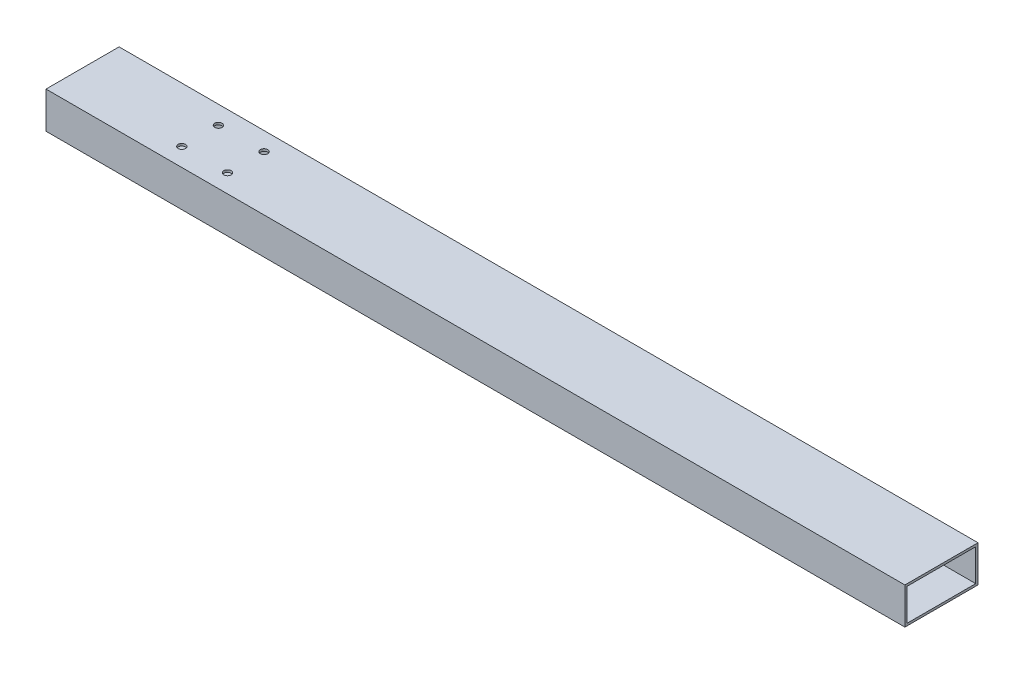
ISO-10303-21;
HEADER;
FILE_DESCRIPTION(('STEP AP214'),'2;1');
FILE_NAME('part.step','',(''),(''),'','','');
FILE_SCHEMA(('AUTOMOTIVE_DESIGN { 1 0 10303 214 1 1 1 1 }'));
ENDSEC;
DATA;
#1=APPLICATION_CONTEXT('core data for automotive mechanical design processes');
#2=APPLICATION_PROTOCOL_DEFINITION('international standard','automotive_design',2000,#1);
#3=PRODUCT_CONTEXT('',#1,'mechanical');
#4=PRODUCT('Part','Part','',(#3));
#5=PRODUCT_RELATED_PRODUCT_CATEGORY('part','',(#4));
#6=PRODUCT_DEFINITION_FORMATION('','',#4);
#7=PRODUCT_DEFINITION_CONTEXT('part definition',#1,'design');
#8=PRODUCT_DEFINITION('design','',#6,#7);
#9=PRODUCT_DEFINITION_SHAPE('','',#8);
#10=(LENGTH_UNIT() NAMED_UNIT(*) SI_UNIT(.MILLI.,.METRE.));
#11=(NAMED_UNIT(*) PLANE_ANGLE_UNIT() SI_UNIT($,.RADIAN.));
#12=(NAMED_UNIT(*) SI_UNIT($,.STERADIAN.) SOLID_ANGLE_UNIT());
#13=UNCERTAINTY_MEASURE_WITH_UNIT(LENGTH_MEASURE(1.E-05),#10,'distance_accuracy_value','');
#14=(GEOMETRIC_REPRESENTATION_CONTEXT(3) GLOBAL_UNCERTAINTY_ASSIGNED_CONTEXT((#13)) GLOBAL_UNIT_ASSIGNED_CONTEXT((#10,
#11,#12)) REPRESENTATION_CONTEXT('',''));
#15=CARTESIAN_POINT('',(0.,0.,0.));
#16=DIRECTION('',(0.,0.,1.));
#17=DIRECTION('',(1.,0.,0.));
#18=AXIS2_PLACEMENT_3D('',#15,#16,#17);
#19=CARTESIAN_POINT('',(113.461200000006,-12.7,-12.6857116241089));
#20=DIRECTION('',(0.,-1.,0.));
#21=DIRECTION('',(0.,0.,-1.));
#22=AXIS2_PLACEMENT_3D('',#19,#20,#21);
#23=CYLINDRICAL_SURFACE('',#22,4.7625);
#24=CARTESIAN_POINT('',(113.461200000006,-11.1125,-12.6857116241089));
#25=DIRECTION('',(0.,-1.,0.));
#26=DIRECTION('',(0.,0.,-1.));
#27=AXIS2_PLACEMENT_3D('',#24,#25,#26);
#28=CIRCLE('',#27,4.7625);
#29=CARTESIAN_POINT('',(113.461200000006,-11.1125,-17.4482116241089));
#30=VERTEX_POINT('',#29);
#31=EDGE_CURVE('E152',#30,#30,#28,.T.);
#32=ORIENTED_EDGE('',*,*,#31,.F.);
#33=EDGE_LOOP('',(#32));
#34=FACE_BOUND('',#33,.T.);
#35=CARTESIAN_POINT('',(113.461200000006,-12.7,-12.6857116241089));
#36=DIRECTION('',(0.,-1.,0.));
#37=DIRECTION('',(0.,0.,-1.));
#38=AXIS2_PLACEMENT_3D('',#35,#36,#37);
#39=CIRCLE('',#38,4.7625);
#40=CARTESIAN_POINT('',(113.461200000006,-12.7,-17.4482116241089));
#41=VERTEX_POINT('',#40);
#42=EDGE_CURVE('E19',#41,#41,#39,.F.);
#43=ORIENTED_EDGE('',*,*,#42,.F.);
#44=EDGE_LOOP('',(#43));
#45=FACE_BOUND('',#44,.T.);
#46=ADVANCED_FACE('F16',(#34,#45),#23,.F.);
#47=CARTESIAN_POINT('',(81.7112000000062,-12.7,-12.6857116241089));
#48=DIRECTION('',(0.,-1.,0.));
#49=DIRECTION('',(0.,0.,-1.));
#50=AXIS2_PLACEMENT_3D('',#47,#48,#49);
#51=CYLINDRICAL_SURFACE('',#50,4.7625);
#52=CARTESIAN_POINT('',(81.7112000000062,-11.1125,-12.6857116241089));
#53=DIRECTION('',(0.,-1.,0.));
#54=DIRECTION('',(0.,0.,-1.));
#55=AXIS2_PLACEMENT_3D('',#52,#53,#54);
#56=CIRCLE('',#55,4.7625);
#57=CARTESIAN_POINT('',(81.7112000000062,-11.1125,-17.4482116241089));
#58=VERTEX_POINT('',#57);
#59=EDGE_CURVE('E149',#58,#58,#56,.T.);
#60=ORIENTED_EDGE('',*,*,#59,.F.);
#61=EDGE_LOOP('',(#60));
#62=FACE_BOUND('',#61,.T.);
#63=CARTESIAN_POINT('',(81.7112000000062,-12.7,-12.6857116241089));
#64=DIRECTION('',(0.,-1.,0.));
#65=DIRECTION('',(0.,0.,-1.));
#66=AXIS2_PLACEMENT_3D('',#63,#64,#65);
#67=CIRCLE('',#66,4.7625);
#68=CARTESIAN_POINT('',(81.7112000000062,-12.7,-17.4482116241089));
#69=VERTEX_POINT('',#68);
#70=EDGE_CURVE('E160',#69,#69,#67,.F.);
#71=ORIENTED_EDGE('',*,*,#70,.F.);
#72=EDGE_LOOP('',(#71));
#73=FACE_BOUND('',#72,.T.);
#74=ADVANCED_FACE('F171',(#62,#73),#51,.F.);
#75=CARTESIAN_POINT('',(81.7112000000062,-12.7,12.7142883758911));
#76=DIRECTION('',(0.,-1.,0.));
#77=DIRECTION('',(0.,0.,-1.));
#78=AXIS2_PLACEMENT_3D('',#75,#76,#77);
#79=CYLINDRICAL_SURFACE('',#78,4.7625);
#80=CARTESIAN_POINT('',(81.7112000000062,-11.1125,12.7142883758911));
#81=DIRECTION('',(0.,-1.,0.));
#82=DIRECTION('',(0.,0.,-1.));
#83=AXIS2_PLACEMENT_3D('',#80,#81,#82);
#84=CIRCLE('',#83,4.7625);
#85=CARTESIAN_POINT('',(81.7112000000062,-11.1125,7.95178837589106));
#86=VERTEX_POINT('',#85);
#87=EDGE_CURVE('E146',#86,#86,#84,.T.);
#88=ORIENTED_EDGE('',*,*,#87,.F.);
#89=EDGE_LOOP('',(#88));
#90=FACE_BOUND('',#89,.T.);
#91=CARTESIAN_POINT('',(81.7112000000062,-12.7,12.7142883758911));
#92=DIRECTION('',(0.,-1.,0.));
#93=DIRECTION('',(0.,0.,-1.));
#94=AXIS2_PLACEMENT_3D('',#91,#92,#93);
#95=CIRCLE('',#94,4.7625);
#96=CARTESIAN_POINT('',(81.7112000000062,-12.7,7.95178837589106));
#97=VERTEX_POINT('',#96);
#98=EDGE_CURVE('E158',#97,#97,#95,.F.);
#99=ORIENTED_EDGE('',*,*,#98,.F.);
#100=EDGE_LOOP('',(#99));
#101=FACE_BOUND('',#100,.T.);
#102=ADVANCED_FACE('F177',(#90,#101),#79,.F.);
#103=CARTESIAN_POINT('',(113.461200000006,-12.7,12.7142883758911));
#104=DIRECTION('',(0.,-1.,0.));
#105=DIRECTION('',(0.,0.,-1.));
#106=AXIS2_PLACEMENT_3D('',#103,#104,#105);
#107=CYLINDRICAL_SURFACE('',#106,4.7625);
#108=CARTESIAN_POINT('',(113.461200000006,-11.1125,12.7142883758911));
#109=DIRECTION('',(0.,-1.,0.));
#110=DIRECTION('',(0.,0.,-1.));
#111=AXIS2_PLACEMENT_3D('',#108,#109,#110);
#112=CIRCLE('',#111,4.7625);
#113=CARTESIAN_POINT('',(113.461200000006,-11.1125,7.95178837589106));
#114=VERTEX_POINT('',#113);
#115=EDGE_CURVE('E119',#114,#114,#112,.T.);
#116=ORIENTED_EDGE('',*,*,#115,.F.);
#117=EDGE_LOOP('',(#116));
#118=FACE_BOUND('',#117,.T.);
#119=CARTESIAN_POINT('',(113.461200000006,-12.7,12.7142883758911));
#120=DIRECTION('',(0.,-1.,0.));
#121=DIRECTION('',(0.,0.,-1.));
#122=AXIS2_PLACEMENT_3D('',#119,#120,#121);
#123=CIRCLE('',#122,4.7625);
#124=CARTESIAN_POINT('',(113.461200000006,-12.7,7.95178837589106));
#125=VERTEX_POINT('',#124);
#126=EDGE_CURVE('E155',#125,#125,#123,.F.);
#127=ORIENTED_EDGE('',*,*,#126,.F.);
#128=EDGE_LOOP('',(#127));
#129=FACE_BOUND('',#128,.T.);
#130=ADVANCED_FACE('F232',(#118,#129),#107,.F.);
#131=CARTESIAN_POINT('',(0.,-12.7,25.4));
#132=DIRECTION('',(0.,-1.,0.));
#133=DIRECTION('',(0.,0.,-1.));
#134=AXIS2_PLACEMENT_3D('',#131,#132,#133);
#135=PLANE('',#134);
#136=ORIENTED_EDGE('',*,*,#126,.T.);
#137=EDGE_LOOP('',(#136));
#138=FACE_BOUND('',#137,.T.);
#139=ORIENTED_EDGE('',*,*,#98,.T.);
#140=EDGE_LOOP('',(#139));
#141=FACE_BOUND('',#140,.T.);
#142=ORIENTED_EDGE('',*,*,#70,.T.);
#143=EDGE_LOOP('',(#142));
#144=FACE_BOUND('',#143,.T.);
#145=ORIENTED_EDGE('',*,*,#42,.T.);
#146=EDGE_LOOP('',(#145));
#147=FACE_BOUND('',#146,.T.);
#148=DIRECTION('',(1.,0.,0.));
#149=VECTOR('',#148,1.);
#150=CARTESIAN_POINT('',(0.,-12.7,25.4));
#151=LINE('',#150,#149);
#152=CARTESIAN_POINT('',(0.,-12.7,25.4));
#153=VERTEX_POINT('',#152);
#154=CARTESIAN_POINT('',(596.9,-12.7,25.4));
#155=VERTEX_POINT('',#154);
#156=EDGE_CURVE('E90',#153,#155,#151,.T.);
#157=ORIENTED_EDGE('',*,*,#156,.F.);
#158=DIRECTION('',(0.,0.,-1.));
#159=VECTOR('',#158,1.);
#160=CARTESIAN_POINT('',(0.,-12.7,0.));
#161=LINE('',#160,#159);
#162=CARTESIAN_POINT('',(0.,-12.7,-25.4));
#163=VERTEX_POINT('',#162);
#164=EDGE_CURVE('E257',#153,#163,#161,.T.);
#165=ORIENTED_EDGE('',*,*,#164,.T.);
#166=DIRECTION('',(-1.,0.,0.));
#167=VECTOR('',#166,1.);
#168=CARTESIAN_POINT('',(0.,-12.7,-25.4));
#169=LINE('',#168,#167);
#170=CARTESIAN_POINT('',(596.9,-12.7,-25.4));
#171=VERTEX_POINT('',#170);
#172=EDGE_CURVE('E268',#171,#163,#169,.T.);
#173=ORIENTED_EDGE('',*,*,#172,.F.);
#174=DIRECTION('',(0.,0.,-1.));
#175=VECTOR('',#174,1.);
#176=CARTESIAN_POINT('',(596.9,-12.7,0.));
#177=LINE('',#176,#175);
#178=EDGE_CURVE('E105',#155,#171,#177,.T.);
#179=ORIENTED_EDGE('',*,*,#178,.F.);
#180=EDGE_LOOP('',(#157,#165,#173,#179));
#181=FACE_BOUND('',#180,.T.);
#182=ADVANCED_FACE('F167',(#138,#141,#144,#147,#181),#135,.T.);
#183=CARTESIAN_POINT('',(0.,-11.1125,-23.8125));
#184=DIRECTION('',(0.,1.,0.));
#185=DIRECTION('',(0.,0.,1.));
#186=AXIS2_PLACEMENT_3D('',#183,#184,#185);
#187=PLANE('',#186);
#188=ORIENTED_EDGE('',*,*,#115,.T.);
#189=EDGE_LOOP('',(#188));
#190=FACE_BOUND('',#189,.T.);
#191=ORIENTED_EDGE('',*,*,#87,.T.);
#192=EDGE_LOOP('',(#191));
#193=FACE_BOUND('',#192,.T.);
#194=ORIENTED_EDGE('',*,*,#59,.T.);
#195=EDGE_LOOP('',(#194));
#196=FACE_BOUND('',#195,.T.);
#197=ORIENTED_EDGE('',*,*,#31,.T.);
#198=EDGE_LOOP('',(#197));
#199=FACE_BOUND('',#198,.T.);
#200=DIRECTION('',(1.,0.,0.));
#201=VECTOR('',#200,1.);
#202=CARTESIAN_POINT('',(0.,-11.1125,-23.8125));
#203=LINE('',#202,#201);
#204=CARTESIAN_POINT('',(0.,-11.1125,-23.8125));
#205=VERTEX_POINT('',#204);
#206=CARTESIAN_POINT('',(596.9,-11.1125,-23.8125));
#207=VERTEX_POINT('',#206);
#208=EDGE_CURVE('E116',#205,#207,#203,.T.);
#209=ORIENTED_EDGE('',*,*,#208,.F.);
#210=DIRECTION('',(0.,0.,-1.));
#211=VECTOR('',#210,1.);
#212=CARTESIAN_POINT('',(0.,-11.1125,0.));
#213=LINE('',#212,#211);
#214=CARTESIAN_POINT('',(0.,-11.1125,23.8125));
#215=VERTEX_POINT('',#214);
#216=EDGE_CURVE('E252',#205,#215,#213,.F.);
#217=ORIENTED_EDGE('',*,*,#216,.T.);
#218=DIRECTION('',(-1.,0.,0.));
#219=VECTOR('',#218,1.);
#220=CARTESIAN_POINT('',(0.,-11.1125,23.8125));
#221=LINE('',#220,#219);
#222=CARTESIAN_POINT('',(596.9,-11.1125,23.8125));
#223=VERTEX_POINT('',#222);
#224=EDGE_CURVE('E118',#223,#215,#221,.T.);
#225=ORIENTED_EDGE('',*,*,#224,.F.);
#226=DIRECTION('',(0.,0.,-1.));
#227=VECTOR('',#226,1.);
#228=CARTESIAN_POINT('',(596.9,-11.1125,0.));
#229=LINE('',#228,#227);
#230=EDGE_CURVE('E104',#207,#223,#229,.F.);
#231=ORIENTED_EDGE('',*,*,#230,.F.);
#232=EDGE_LOOP('',(#209,#217,#225,#231));
#233=FACE_BOUND('',#232,.T.);
#234=ADVANCED_FACE('F226',(#190,#193,#196,#199,#233),#187,.T.);
#235=CARTESIAN_POINT('',(0.,-11.1125,23.8125));
#236=DIRECTION('',(0.,0.,-1.));
#237=DIRECTION('',(-1.,0.,0.));
#238=AXIS2_PLACEMENT_3D('',#235,#236,#237);
#239=PLANE('',#238);
#240=ORIENTED_EDGE('',*,*,#224,.T.);
#241=DIRECTION('',(0.,1.,0.));
#242=VECTOR('',#241,1.);
#243=CARTESIAN_POINT('',(0.,0.,23.8125));
#244=LINE('',#243,#242);
#245=CARTESIAN_POINT('',(0.,11.1125,23.8125));
#246=VERTEX_POINT('',#245);
#247=EDGE_CURVE('E86',#215,#246,#244,.T.);
#248=ORIENTED_EDGE('',*,*,#247,.T.);
#249=DIRECTION('',(1.,0.,0.));
#250=VECTOR('',#249,1.);
#251=CARTESIAN_POINT('',(0.,11.1125,23.8125));
#252=LINE('',#251,#250);
#253=CARTESIAN_POINT('',(596.9,11.1125,23.8125));
#254=VERTEX_POINT('',#253);
#255=EDGE_CURVE('E78',#254,#246,#252,.F.);
#256=ORIENTED_EDGE('',*,*,#255,.F.);
#257=DIRECTION('',(0.,1.,0.));
#258=VECTOR('',#257,1.);
#259=CARTESIAN_POINT('',(596.9,0.,23.8125));
#260=LINE('',#259,#258);
#261=EDGE_CURVE('E83',#223,#254,#260,.T.);
#262=ORIENTED_EDGE('',*,*,#261,.F.);
#263=EDGE_LOOP('',(#240,#248,#256,#262));
#264=FACE_BOUND('',#263,.T.);
#265=ADVANCED_FACE('F81',(#264),#239,.T.);
#266=CARTESIAN_POINT('',(0.,11.1125,-23.8125));
#267=DIRECTION('',(0.,0.,1.));
#268=DIRECTION('',(1.,0.,0.));
#269=AXIS2_PLACEMENT_3D('',#266,#267,#268);
#270=PLANE('',#269);
#271=DIRECTION('',(1.,0.,0.));
#272=VECTOR('',#271,1.);
#273=CARTESIAN_POINT('',(0.,11.1125,-23.8125));
#274=LINE('',#273,#272);
#275=CARTESIAN_POINT('',(0.,11.1125,-23.8125));
#276=VERTEX_POINT('',#275);
#277=CARTESIAN_POINT('',(596.9,11.1125,-23.8125));
#278=VERTEX_POINT('',#277);
#279=EDGE_CURVE('E91',#276,#278,#274,.T.);
#280=ORIENTED_EDGE('',*,*,#279,.F.);
#281=DIRECTION('',(0.,1.,0.));
#282=VECTOR('',#281,1.);
#283=CARTESIAN_POINT('',(0.,0.,-23.8125));
#284=LINE('',#283,#282);
#285=EDGE_CURVE('E143',#276,#205,#284,.F.);
#286=ORIENTED_EDGE('',*,*,#285,.T.);
#287=ORIENTED_EDGE('',*,*,#208,.T.);
#288=DIRECTION('',(0.,1.,0.));
#289=VECTOR('',#288,1.);
#290=CARTESIAN_POINT('',(596.9,0.,-23.8125));
#291=LINE('',#290,#289);
#292=EDGE_CURVE('E99',#278,#207,#291,.F.);
#293=ORIENTED_EDGE('',*,*,#292,.F.);
#294=EDGE_LOOP('',(#280,#286,#287,#293));
#295=FACE_BOUND('',#294,.T.);
#296=ADVANCED_FACE('F219',(#295),#270,.T.);
#297=CARTESIAN_POINT('',(0.,11.1125,23.8125));
#298=DIRECTION('',(0.,-1.,0.));
#299=DIRECTION('',(0.,0.,-1.));
#300=AXIS2_PLACEMENT_3D('',#297,#298,#299);
#301=PLANE('',#300);
#302=CARTESIAN_POINT('',(113.461200000006,11.1125,12.7142883758911));
#303=DIRECTION('',(0.,-1.,0.));
#304=DIRECTION('',(0.,0.,-1.));
#305=AXIS2_PLACEMENT_3D('',#302,#303,#304);
#306=CIRCLE('',#305,2.5527);
#307=CARTESIAN_POINT('',(113.461200000006,11.1125,10.1615883758911));
#308=VERTEX_POINT('',#307);
#309=EDGE_CURVE('E130',#308,#308,#306,.F.);
#310=ORIENTED_EDGE('',*,*,#309,.T.);
#311=EDGE_LOOP('',(#310));
#312=FACE_BOUND('',#311,.T.);
#313=CARTESIAN_POINT('',(81.7112000000062,11.1125,12.7142883758911));
#314=DIRECTION('',(0.,-1.,0.));
#315=DIRECTION('',(0.,0.,-1.));
#316=AXIS2_PLACEMENT_3D('',#313,#314,#315);
#317=CIRCLE('',#316,2.5527);
#318=CARTESIAN_POINT('',(81.7112000000062,11.1125,10.1615883758911));
#319=VERTEX_POINT('',#318);
#320=EDGE_CURVE('E134',#319,#319,#317,.F.);
#321=ORIENTED_EDGE('',*,*,#320,.T.);
#322=EDGE_LOOP('',(#321));
#323=FACE_BOUND('',#322,.T.);
#324=CARTESIAN_POINT('',(81.7112000000062,11.1125,-12.6857116241089));
#325=DIRECTION('',(0.,-1.,0.));
#326=DIRECTION('',(0.,0.,-1.));
#327=AXIS2_PLACEMENT_3D('',#324,#325,#326);
#328=CIRCLE('',#327,2.5527);
#329=CARTESIAN_POINT('',(81.7112000000062,11.1125,-15.2384116241089));
#330=VERTEX_POINT('',#329);
#331=EDGE_CURVE('E137',#330,#330,#328,.F.);
#332=ORIENTED_EDGE('',*,*,#331,.T.);
#333=EDGE_LOOP('',(#332));
#334=FACE_BOUND('',#333,.T.);
#335=CARTESIAN_POINT('',(113.461200000006,11.1125,-12.6857116241089));
#336=DIRECTION('',(0.,-1.,0.));
#337=DIRECTION('',(0.,0.,-1.));
#338=AXIS2_PLACEMENT_3D('',#335,#336,#337);
#339=CIRCLE('',#338,2.5527);
#340=CARTESIAN_POINT('',(113.461200000006,11.1125,-15.2384116241089));
#341=VERTEX_POINT('',#340);
#342=EDGE_CURVE('E140',#341,#341,#339,.F.);
#343=ORIENTED_EDGE('',*,*,#342,.T.);
#344=EDGE_LOOP('',(#343));
#345=FACE_BOUND('',#344,.T.);
#346=ORIENTED_EDGE('',*,*,#255,.T.);
#347=DIRECTION('',(0.,0.,-1.));
#348=VECTOR('',#347,1.);
#349=CARTESIAN_POINT('',(0.,11.1125,0.));
#350=LINE('',#349,#348);
#351=EDGE_CURVE('E254',#246,#276,#350,.T.);
#352=ORIENTED_EDGE('',*,*,#351,.T.);
#353=ORIENTED_EDGE('',*,*,#279,.T.);
#354=DIRECTION('',(0.,0.,-1.));
#355=VECTOR('',#354,1.);
#356=CARTESIAN_POINT('',(596.9,11.1125,0.));
#357=LINE('',#356,#355);
#358=EDGE_CURVE('E94',#254,#278,#357,.T.);
#359=ORIENTED_EDGE('',*,*,#358,.F.);
#360=EDGE_LOOP('',(#346,#352,#353,#359));
#361=FACE_BOUND('',#360,.T.);
#362=ADVANCED_FACE('F95',(#312,#323,#334,#345,#361),#301,.T.);
#363=CARTESIAN_POINT('',(0.,12.7,25.4));
#364=DIRECTION('',(0.,0.,1.));
#365=DIRECTION('',(1.,0.,0.));
#366=AXIS2_PLACEMENT_3D('',#363,#364,#365);
#367=PLANE('',#366);
#368=DIRECTION('',(1.,0.,0.));
#369=VECTOR('',#368,1.);
#370=CARTESIAN_POINT('',(0.,12.7,25.4));
#371=LINE('',#370,#369);
#372=CARTESIAN_POINT('',(0.,12.7,25.4));
#373=VERTEX_POINT('',#372);
#374=CARTESIAN_POINT('',(596.9,12.7,25.4));
#375=VERTEX_POINT('',#374);
#376=EDGE_CURVE('E133',#373,#375,#371,.T.);
#377=ORIENTED_EDGE('',*,*,#376,.F.);
#378=DIRECTION('',(0.,1.,0.));
#379=VECTOR('',#378,1.);
#380=CARTESIAN_POINT('',(0.,0.,25.4));
#381=LINE('',#380,#379);
#382=EDGE_CURVE('E261',#373,#153,#381,.F.);
#383=ORIENTED_EDGE('',*,*,#382,.T.);
#384=ORIENTED_EDGE('',*,*,#156,.T.);
#385=DIRECTION('',(0.,1.,0.));
#386=VECTOR('',#385,1.);
#387=CARTESIAN_POINT('',(596.9,0.,25.4));
#388=LINE('',#387,#386);
#389=EDGE_CURVE('E107',#375,#155,#388,.F.);
#390=ORIENTED_EDGE('',*,*,#389,.F.);
#391=EDGE_LOOP('',(#377,#383,#384,#390));
#392=FACE_BOUND('',#391,.T.);
#393=ADVANCED_FACE('F213',(#392),#367,.T.);
#394=CARTESIAN_POINT('',(596.9,0.,0.));
#395=DIRECTION('',(1.,0.,0.));
#396=DIRECTION('',(0.,0.,-1.));
#397=AXIS2_PLACEMENT_3D('',#394,#395,#396);
#398=PLANE('',#397);
#399=ORIENTED_EDGE('',*,*,#292,.T.);
#400=ORIENTED_EDGE('',*,*,#230,.T.);
#401=ORIENTED_EDGE('',*,*,#261,.T.);
#402=ORIENTED_EDGE('',*,*,#358,.T.);
#403=EDGE_LOOP('',(#399,#400,#401,#402));
#404=FACE_BOUND('',#403,.T.);
#405=ORIENTED_EDGE('',*,*,#178,.T.);
#406=DIRECTION('',(0.,1.,0.));
#407=VECTOR('',#406,1.);
#408=CARTESIAN_POINT('',(596.9,-12.7,-25.4));
#409=LINE('',#408,#407);
#410=CARTESIAN_POINT('',(596.9,12.7,-25.4));
#411=VERTEX_POINT('',#410);
#412=EDGE_CURVE('E270',#411,#171,#409,.F.);
#413=ORIENTED_EDGE('',*,*,#412,.F.);
#414=DIRECTION('',(0.,0.,1.));
#415=VECTOR('',#414,1.);
#416=CARTESIAN_POINT('',(596.9,12.7,-25.4));
#417=LINE('',#416,#415);
#418=EDGE_CURVE('E278',#375,#411,#417,.F.);
#419=ORIENTED_EDGE('',*,*,#418,.F.);
#420=ORIENTED_EDGE('',*,*,#389,.T.);
#421=EDGE_LOOP('',(#405,#413,#419,#420));
#422=FACE_BOUND('',#421,.T.);
#423=ADVANCED_FACE('F101',(#404,#422),#398,.T.);
#424=CARTESIAN_POINT('',(0.,-12.7,-25.4));
#425=DIRECTION('',(0.,0.,-1.));
#426=DIRECTION('',(-1.,0.,0.));
#427=AXIS2_PLACEMENT_3D('',#424,#425,#426);
#428=PLANE('',#427);
#429=ORIENTED_EDGE('',*,*,#172,.T.);
#430=DIRECTION('',(0.,1.,0.));
#431=VECTOR('',#430,1.);
#432=CARTESIAN_POINT('',(0.,0.,-25.4));
#433=LINE('',#432,#431);
#434=CARTESIAN_POINT('',(0.,12.7,-25.4));
#435=VERTEX_POINT('',#434);
#436=EDGE_CURVE('E34',#163,#435,#433,.T.);
#437=ORIENTED_EDGE('',*,*,#436,.T.);
#438=DIRECTION('',(1.,0.,0.));
#439=VECTOR('',#438,1.);
#440=CARTESIAN_POINT('',(0.,12.7,-25.4));
#441=LINE('',#440,#439);
#442=EDGE_CURVE('E275',#411,#435,#441,.F.);
#443=ORIENTED_EDGE('',*,*,#442,.F.);
#444=ORIENTED_EDGE('',*,*,#412,.T.);
#445=EDGE_LOOP('',(#429,#437,#443,#444));
#446=FACE_BOUND('',#445,.T.);
#447=ADVANCED_FACE('F207',(#446),#428,.T.);
#448=CARTESIAN_POINT('',(0.,0.,0.));
#449=DIRECTION('',(1.,0.,0.));
#450=DIRECTION('',(0.,0.,-1.));
#451=AXIS2_PLACEMENT_3D('',#448,#449,#450);
#452=PLANE('',#451);
#453=ORIENTED_EDGE('',*,*,#351,.F.);
#454=ORIENTED_EDGE('',*,*,#247,.F.);
#455=ORIENTED_EDGE('',*,*,#216,.F.);
#456=ORIENTED_EDGE('',*,*,#285,.F.);
#457=EDGE_LOOP('',(#453,#454,#455,#456));
#458=FACE_BOUND('',#457,.T.);
#459=ORIENTED_EDGE('',*,*,#382,.F.);
#460=DIRECTION('',(0.,0.,1.));
#461=VECTOR('',#460,1.);
#462=CARTESIAN_POINT('',(0.,12.7,-25.4));
#463=LINE('',#462,#461);
#464=EDGE_CURVE('E129',#435,#373,#463,.T.);
#465=ORIENTED_EDGE('',*,*,#464,.F.);
#466=ORIENTED_EDGE('',*,*,#436,.F.);
#467=ORIENTED_EDGE('',*,*,#164,.F.);
#468=EDGE_LOOP('',(#459,#465,#466,#467));
#469=FACE_BOUND('',#468,.T.);
#470=ADVANCED_FACE('F203',(#458,#469),#452,.F.);
#471=CARTESIAN_POINT('',(113.461200000006,-87.6554,-12.6857116241089));
#472=DIRECTION('',(0.,-1.,0.));
#473=DIRECTION('',(0.,0.,-1.));
#474=AXIS2_PLACEMENT_3D('',#471,#472,#473);
#475=CYLINDRICAL_SURFACE('',#474,2.5527);
#476=ORIENTED_EDGE('',*,*,#342,.F.);
#477=EDGE_LOOP('',(#476));
#478=FACE_BOUND('',#477,.T.);
#479=CARTESIAN_POINT('',(113.461200000006,12.7,-12.6857116241089));
#480=DIRECTION('',(0.,-1.,0.));
#481=DIRECTION('',(0.,0.,-1.));
#482=AXIS2_PLACEMENT_3D('',#479,#480,#481);
#483=CIRCLE('',#482,2.5527);
#484=CARTESIAN_POINT('',(113.461200000006,12.7,-15.2384116241089));
#485=VERTEX_POINT('',#484);
#486=EDGE_CURVE('E126',#485,#485,#483,.T.);
#487=ORIENTED_EDGE('',*,*,#486,.F.);
#488=EDGE_LOOP('',(#487));
#489=FACE_BOUND('',#488,.T.);
#490=ADVANCED_FACE('F199',(#478,#489),#475,.F.);
#491=CARTESIAN_POINT('',(81.7112000000062,-87.6554,-12.6857116241089));
#492=DIRECTION('',(0.,-1.,0.));
#493=DIRECTION('',(0.,0.,-1.));
#494=AXIS2_PLACEMENT_3D('',#491,#492,#493);
#495=CYLINDRICAL_SURFACE('',#494,2.5527);
#496=ORIENTED_EDGE('',*,*,#331,.F.);
#497=EDGE_LOOP('',(#496));
#498=FACE_BOUND('',#497,.T.);
#499=CARTESIAN_POINT('',(81.7112000000062,12.7,-12.6857116241089));
#500=DIRECTION('',(0.,-1.,0.));
#501=DIRECTION('',(0.,0.,-1.));
#502=AXIS2_PLACEMENT_3D('',#499,#500,#501);
#503=CIRCLE('',#502,2.5527);
#504=CARTESIAN_POINT('',(81.7112000000062,12.7,-15.2384116241089));
#505=VERTEX_POINT('',#504);
#506=EDGE_CURVE('E123',#505,#505,#503,.T.);
#507=ORIENTED_EDGE('',*,*,#506,.F.);
#508=EDGE_LOOP('',(#507));
#509=FACE_BOUND('',#508,.T.);
#510=ADVANCED_FACE('F195',(#498,#509),#495,.F.);
#511=CARTESIAN_POINT('',(81.7112000000062,-87.6554,12.7142883758911));
#512=DIRECTION('',(0.,-1.,0.));
#513=DIRECTION('',(0.,0.,-1.));
#514=AXIS2_PLACEMENT_3D('',#511,#512,#513);
#515=CYLINDRICAL_SURFACE('',#514,2.5527);
#516=ORIENTED_EDGE('',*,*,#320,.F.);
#517=EDGE_LOOP('',(#516));
#518=FACE_BOUND('',#517,.T.);
#519=CARTESIAN_POINT('',(81.7112000000062,12.7,12.7142883758911));
#520=DIRECTION('',(0.,-1.,0.));
#521=DIRECTION('',(0.,0.,-1.));
#522=AXIS2_PLACEMENT_3D('',#519,#520,#521);
#523=CIRCLE('',#522,2.5527);
#524=CARTESIAN_POINT('',(81.7112000000062,12.7,10.1615883758911));
#525=VERTEX_POINT('',#524);
#526=EDGE_CURVE('E25',#525,#525,#523,.T.);
#527=ORIENTED_EDGE('',*,*,#526,.F.);
#528=EDGE_LOOP('',(#527));
#529=FACE_BOUND('',#528,.T.);
#530=ADVANCED_FACE('F188',(#518,#529),#515,.F.);
#531=CARTESIAN_POINT('',(113.461200000006,-87.6554,12.7142883758911));
#532=DIRECTION('',(0.,-1.,0.));
#533=DIRECTION('',(0.,0.,-1.));
#534=AXIS2_PLACEMENT_3D('',#531,#532,#533);
#535=CYLINDRICAL_SURFACE('',#534,2.5527);
#536=ORIENTED_EDGE('',*,*,#309,.F.);
#537=EDGE_LOOP('',(#536));
#538=FACE_BOUND('',#537,.T.);
#539=CARTESIAN_POINT('',(113.461200000006,12.7,12.7142883758911));
#540=DIRECTION('',(0.,-1.,0.));
#541=DIRECTION('',(0.,0.,-1.));
#542=AXIS2_PLACEMENT_3D('',#539,#540,#541);
#543=CIRCLE('',#542,2.5527);
#544=CARTESIAN_POINT('',(113.461200000006,12.7,10.1615883758911));
#545=VERTEX_POINT('',#544);
#546=EDGE_CURVE('E11',#545,#545,#543,.T.);
#547=ORIENTED_EDGE('',*,*,#546,.F.);
#548=EDGE_LOOP('',(#547));
#549=FACE_BOUND('',#548,.T.);
#550=ADVANCED_FACE('F182',(#538,#549),#535,.F.);
#551=CARTESIAN_POINT('',(0.,12.7,-25.4));
#552=DIRECTION('',(0.,1.,0.));
#553=DIRECTION('',(0.,0.,1.));
#554=AXIS2_PLACEMENT_3D('',#551,#552,#553);
#555=PLANE('',#554);
#556=ORIENTED_EDGE('',*,*,#546,.T.);
#557=EDGE_LOOP('',(#556));
#558=FACE_BOUND('',#557,.T.);
#559=ORIENTED_EDGE('',*,*,#526,.T.);
#560=EDGE_LOOP('',(#559));
#561=FACE_BOUND('',#560,.T.);
#562=ORIENTED_EDGE('',*,*,#506,.T.);
#563=EDGE_LOOP('',(#562));
#564=FACE_BOUND('',#563,.T.);
#565=ORIENTED_EDGE('',*,*,#486,.T.);
#566=EDGE_LOOP('',(#565));
#567=FACE_BOUND('',#566,.T.);
#568=ORIENTED_EDGE('',*,*,#442,.T.);
#569=ORIENTED_EDGE('',*,*,#464,.T.);
#570=ORIENTED_EDGE('',*,*,#376,.T.);
#571=ORIENTED_EDGE('',*,*,#418,.T.);
#572=EDGE_LOOP('',(#568,#569,#570,#571));
#573=FACE_BOUND('',#572,.T.);
#574=ADVANCED_FACE('F180',(#558,#561,#564,#567,#573),#555,.T.);
#575=CLOSED_SHELL('',(#46,#74,#102,#130,#182,#234,#265,#296,#362,#393,#423,#447,#470,#490,#510,
#530,#550,#574));
#576=MANIFOLD_SOLID_BREP('B1',#575);
#577=ADVANCED_BREP_SHAPE_REPRESENTATION('',(#18,#576),#14);
#578=SHAPE_DEFINITION_REPRESENTATION(#9,#577);
ENDSEC;
END-ISO-10303-21;
